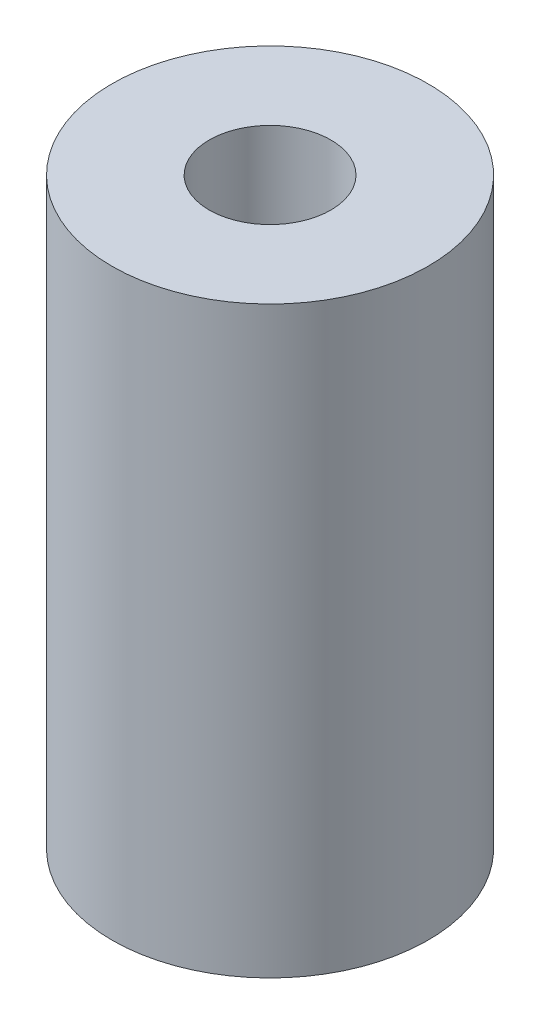
ISO-10303-21;
HEADER;
FILE_DESCRIPTION(('STEP AP214'),'2;1');
FILE_NAME('part.step','',(''),(''),'','','');
FILE_SCHEMA(('AUTOMOTIVE_DESIGN { 1 0 10303 214 1 1 1 1 }'));
ENDSEC;
DATA;
#1=APPLICATION_CONTEXT('core data for automotive mechanical design processes');
#2=APPLICATION_PROTOCOL_DEFINITION('international standard','automotive_design',2000,#1);
#3=PRODUCT_CONTEXT('',#1,'mechanical');
#4=PRODUCT('Part','Part','',(#3));
#5=PRODUCT_RELATED_PRODUCT_CATEGORY('part','',(#4));
#6=PRODUCT_DEFINITION_FORMATION('','',#4);
#7=PRODUCT_DEFINITION_CONTEXT('part definition',#1,'design');
#8=PRODUCT_DEFINITION('design','',#6,#7);
#9=PRODUCT_DEFINITION_SHAPE('','',#8);
#10=(LENGTH_UNIT() NAMED_UNIT(*) SI_UNIT(.MILLI.,.METRE.));
#11=(NAMED_UNIT(*) PLANE_ANGLE_UNIT() SI_UNIT($,.RADIAN.));
#12=(NAMED_UNIT(*) SI_UNIT($,.STERADIAN.) SOLID_ANGLE_UNIT());
#13=UNCERTAINTY_MEASURE_WITH_UNIT(LENGTH_MEASURE(1.E-05),#10,'distance_accuracy_value','');
#14=(GEOMETRIC_REPRESENTATION_CONTEXT(3) GLOBAL_UNCERTAINTY_ASSIGNED_CONTEXT((#13)) GLOBAL_UNIT_ASSIGNED_CONTEXT((#10,
#11,#12)) REPRESENTATION_CONTEXT('',''));
#15=CARTESIAN_POINT('',(0.,0.,0.));
#16=DIRECTION('',(0.,0.,1.));
#17=DIRECTION('',(1.,0.,0.));
#18=AXIS2_PLACEMENT_3D('',#15,#16,#17);
#19=CARTESIAN_POINT('',(0.,4.8,0.));
#20=DIRECTION('',(0.,-1.,0.));
#21=DIRECTION('',(0.,0.,-1.));
#22=AXIS2_PLACEMENT_3D('',#19,#20,#21);
#23=CYLINDRICAL_SURFACE('',#22,0.5);
#24=CARTESIAN_POINT('',(0.,0.,0.));
#25=DIRECTION('',(0.,1.,0.));
#26=DIRECTION('',(0.,0.,1.));
#27=AXIS2_PLACEMENT_3D('',#24,#25,#26);
#28=CIRCLE('',#27,0.5);
#29=CARTESIAN_POINT('',(0.,0.,0.5));
#30=VERTEX_POINT('',#29);
#31=EDGE_CURVE('E52',#30,#30,#28,.T.);
#32=ORIENTED_EDGE('',*,*,#31,.F.);
#33=EDGE_LOOP('',(#32));
#34=FACE_BOUND('',#33,.T.);
#35=CARTESIAN_POINT('',(0.,2.35,0.));
#36=DIRECTION('',(0.,1.,0.));
#37=DIRECTION('',(0.,0.,1.));
#38=AXIS2_PLACEMENT_3D('',#35,#36,#37);
#39=CIRCLE('',#38,0.5);
#40=CARTESIAN_POINT('',(0.,2.35,0.5));
#41=VERTEX_POINT('',#40);
#42=EDGE_CURVE('E71',#41,#41,#39,.T.);
#43=ORIENTED_EDGE('',*,*,#42,.T.);
#44=EDGE_LOOP('',(#43));
#45=FACE_BOUND('',#44,.T.);
#46=ADVANCED_FACE('F37',(#34,#45),#23,.F.);
#47=CARTESIAN_POINT('',(0.,4.8,0.));
#48=DIRECTION('',(0.,1.,0.));
#49=DIRECTION('',(0.,0.,1.));
#50=AXIS2_PLACEMENT_3D('',#47,#48,#49);
#51=PLANE('',#50);
#52=CARTESIAN_POINT('',(0.,4.8,0.));
#53=DIRECTION('',(0.,1.,0.));
#54=DIRECTION('',(0.,0.,1.));
#55=AXIS2_PLACEMENT_3D('',#52,#53,#54);
#56=CIRCLE('',#55,1.3);
#57=CARTESIAN_POINT('',(0.,4.8,1.3));
#58=VERTEX_POINT('',#57);
#59=EDGE_CURVE('E10',#58,#58,#56,.T.);
#60=ORIENTED_EDGE('',*,*,#59,.T.);
#61=EDGE_LOOP('',(#60));
#62=FACE_BOUND('',#61,.T.);
#63=CARTESIAN_POINT('',(0.,4.8,0.));
#64=DIRECTION('',(0.,1.,0.));
#65=DIRECTION('',(0.,0.,1.));
#66=AXIS2_PLACEMENT_3D('',#63,#64,#65);
#67=CIRCLE('',#66,0.5);
#68=CARTESIAN_POINT('',(0.,4.8,0.5));
#69=VERTEX_POINT('',#68);
#70=EDGE_CURVE('E50',#69,#69,#67,.T.);
#71=ORIENTED_EDGE('',*,*,#70,.F.);
#72=EDGE_LOOP('',(#71));
#73=FACE_BOUND('',#72,.T.);
#74=ADVANCED_FACE('F96',(#62,#73),#51,.T.);
#75=CARTESIAN_POINT('',(0.,0.,0.));
#76=DIRECTION('',(0.,1.,0.));
#77=DIRECTION('',(0.,0.,1.));
#78=AXIS2_PLACEMENT_3D('',#75,#76,#77);
#79=PLANE('',#78);
#80=CARTESIAN_POINT('',(0.,0.,0.));
#81=DIRECTION('',(0.,1.,0.));
#82=DIRECTION('',(0.,0.,1.));
#83=AXIS2_PLACEMENT_3D('',#80,#81,#82);
#84=CIRCLE('',#83,1.3);
#85=CARTESIAN_POINT('',(0.,0.,1.3));
#86=VERTEX_POINT('',#85);
#87=EDGE_CURVE('E41',#86,#86,#84,.T.);
#88=ORIENTED_EDGE('',*,*,#87,.F.);
#89=EDGE_LOOP('',(#88));
#90=FACE_BOUND('',#89,.T.);
#91=ORIENTED_EDGE('',*,*,#31,.T.);
#92=EDGE_LOOP('',(#91));
#93=FACE_BOUND('',#92,.T.);
#94=ADVANCED_FACE('F101',(#90,#93),#79,.F.);
#95=CARTESIAN_POINT('',(0.,4.8,0.));
#96=DIRECTION('',(0.,-1.,0.));
#97=DIRECTION('',(0.,0.,-1.));
#98=AXIS2_PLACEMENT_3D('',#95,#96,#97);
#99=CYLINDRICAL_SURFACE('',#98,1.3);
#100=ORIENTED_EDGE('',*,*,#59,.F.);
#101=EDGE_LOOP('',(#100));
#102=FACE_BOUND('',#101,.T.);
#103=ORIENTED_EDGE('',*,*,#87,.T.);
#104=EDGE_LOOP('',(#103));
#105=FACE_BOUND('',#104,.T.);
#106=ADVANCED_FACE('F39',(#102,#105),#99,.T.);
#107=CARTESIAN_POINT('',(0.,2.45,0.));
#108=DIRECTION('',(0.,1.,0.));
#109=DIRECTION('',(0.,0.,1.));
#110=AXIS2_PLACEMENT_3D('',#107,#108,#109);
#111=CIRCLE('',#110,0.5);
#112=CARTESIAN_POINT('',(0.,2.45,0.5));
#113=VERTEX_POINT('',#112);
#114=EDGE_CURVE('E63',#113,#113,#111,.T.);
#115=ORIENTED_EDGE('',*,*,#114,.F.);
#116=EDGE_LOOP('',(#115));
#117=FACE_BOUND('',#116,.T.);
#118=ORIENTED_EDGE('',*,*,#70,.T.);
#119=EDGE_LOOP('',(#118));
#120=FACE_BOUND('',#119,.T.);
#121=ADVANCED_FACE('F91',(#117,#120),#23,.F.);
#122=CARTESIAN_POINT('',(0.,2.45,0.));
#123=DIRECTION('',(0.,1.,0.));
#124=DIRECTION('',(0.,0.,1.));
#125=AXIS2_PLACEMENT_3D('',#122,#123,#124);
#126=PLANE('',#125);
#127=CARTESIAN_POINT('',(0.,2.45,0.));
#128=DIRECTION('',(0.,1.,0.));
#129=DIRECTION('',(0.,0.,1.));
#130=AXIS2_PLACEMENT_3D('',#127,#128,#129);
#131=CIRCLE('',#130,0.6);
#132=CARTESIAN_POINT('',(0.,2.45,0.6));
#133=VERTEX_POINT('',#132);
#134=EDGE_CURVE('E56',#133,#133,#131,.T.);
#135=ORIENTED_EDGE('',*,*,#134,.F.);
#136=EDGE_LOOP('',(#135));
#137=FACE_BOUND('',#136,.T.);
#138=ORIENTED_EDGE('',*,*,#114,.T.);
#139=EDGE_LOOP('',(#138));
#140=FACE_BOUND('',#139,.T.);
#141=ADVANCED_FACE('F85',(#137,#140),#126,.F.);
#142=CARTESIAN_POINT('',(0.,2.45,0.));
#143=DIRECTION('',(0.,-1.,0.));
#144=DIRECTION('',(0.,0.,-1.));
#145=AXIS2_PLACEMENT_3D('',#142,#143,#144);
#146=CYLINDRICAL_SURFACE('',#145,0.6);
#147=ORIENTED_EDGE('',*,*,#134,.T.);
#148=EDGE_LOOP('',(#147));
#149=FACE_BOUND('',#148,.T.);
#150=CARTESIAN_POINT('',(0.,2.35,0.));
#151=DIRECTION('',(0.,1.,0.));
#152=DIRECTION('',(0.,0.,1.));
#153=AXIS2_PLACEMENT_3D('',#150,#151,#152);
#154=CIRCLE('',#153,0.6);
#155=CARTESIAN_POINT('',(0.,2.35,0.6));
#156=VERTEX_POINT('',#155);
#157=EDGE_CURVE('E67',#156,#156,#154,.T.);
#158=ORIENTED_EDGE('',*,*,#157,.F.);
#159=EDGE_LOOP('',(#158));
#160=FACE_BOUND('',#159,.T.);
#161=ADVANCED_FACE('F80',(#149,#160),#146,.F.);
#162=CARTESIAN_POINT('',(0.,2.35,0.));
#163=DIRECTION('',(0.,1.,0.));
#164=DIRECTION('',(0.,0.,1.));
#165=AXIS2_PLACEMENT_3D('',#162,#163,#164);
#166=PLANE('',#165);
#167=ORIENTED_EDGE('',*,*,#42,.F.);
#168=EDGE_LOOP('',(#167));
#169=FACE_BOUND('',#168,.T.);
#170=ORIENTED_EDGE('',*,*,#157,.T.);
#171=EDGE_LOOP('',(#170));
#172=FACE_BOUND('',#171,.T.);
#173=ADVANCED_FACE('F77',(#169,#172),#166,.T.);
#174=CLOSED_SHELL('',(#46,#74,#94,#106,#121,#141,#161,#173));
#175=MANIFOLD_SOLID_BREP('B2',#174);
#176=ADVANCED_BREP_SHAPE_REPRESENTATION('',(#18,#175),#14);
#177=SHAPE_DEFINITION_REPRESENTATION(#9,#176);
ENDSEC;
END-ISO-10303-21;
